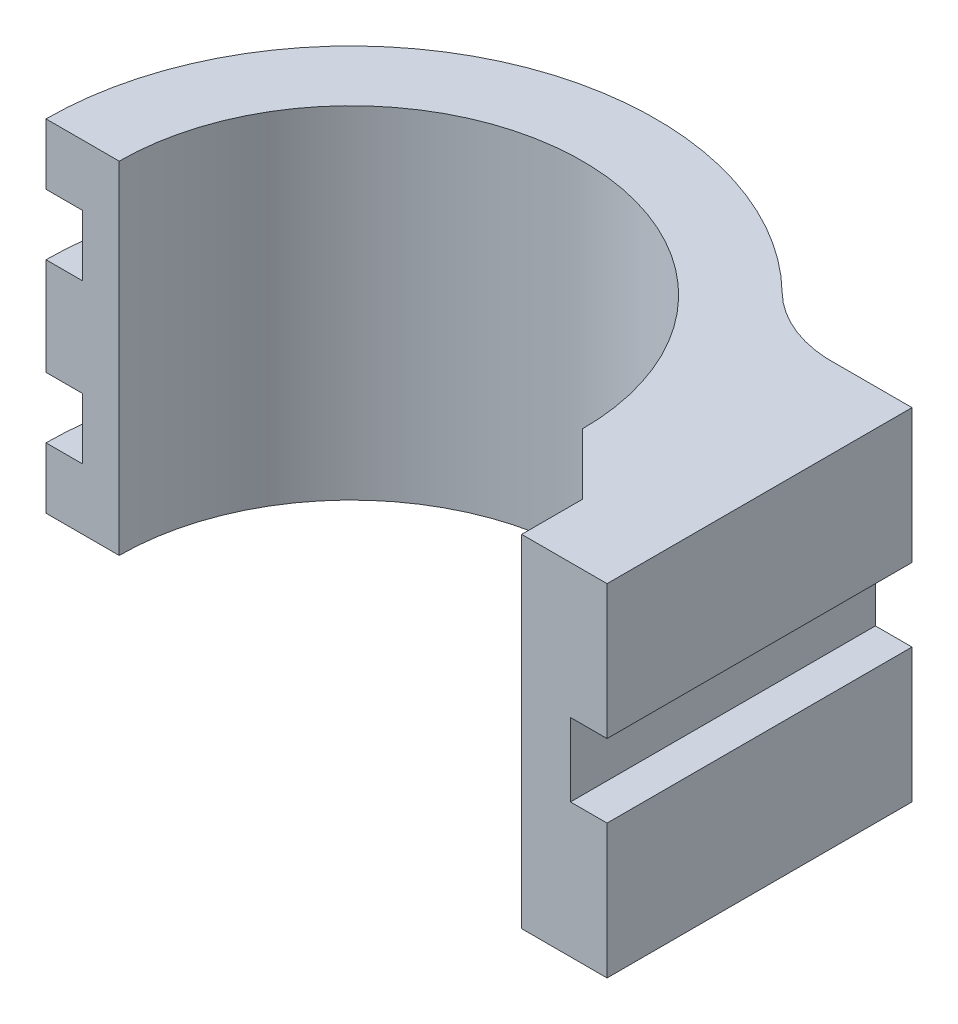
ISO-10303-21;
HEADER;
FILE_DESCRIPTION(('STEP AP214'),'2;1');
FILE_NAME('part.step','',(''),(''),'','','');
FILE_SCHEMA(('AUTOMOTIVE_DESIGN { 1 0 10303 214 1 1 1 1 }'));
ENDSEC;
DATA;
#1=APPLICATION_CONTEXT('core data for automotive mechanical design processes');
#2=APPLICATION_PROTOCOL_DEFINITION('international standard','automotive_design',2000,#1);
#3=PRODUCT_CONTEXT('',#1,'mechanical');
#4=PRODUCT('Part','Part','',(#3));
#5=PRODUCT_RELATED_PRODUCT_CATEGORY('part','',(#4));
#6=PRODUCT_DEFINITION_FORMATION('','',#4);
#7=PRODUCT_DEFINITION_CONTEXT('part definition',#1,'design');
#8=PRODUCT_DEFINITION('design','',#6,#7);
#9=PRODUCT_DEFINITION_SHAPE('','',#8);
#10=(LENGTH_UNIT() NAMED_UNIT(*) SI_UNIT(.MILLI.,.METRE.));
#11=(NAMED_UNIT(*) PLANE_ANGLE_UNIT() SI_UNIT($,.RADIAN.));
#12=(NAMED_UNIT(*) SI_UNIT($,.STERADIAN.) SOLID_ANGLE_UNIT());
#13=UNCERTAINTY_MEASURE_WITH_UNIT(LENGTH_MEASURE(1.E-05),#10,'distance_accuracy_value','');
#14=(GEOMETRIC_REPRESENTATION_CONTEXT(3) GLOBAL_UNCERTAINTY_ASSIGNED_CONTEXT((#13)) GLOBAL_UNIT_ASSIGNED_CONTEXT((#10,
#11,#12)) REPRESENTATION_CONTEXT('',''));
#15=CARTESIAN_POINT('',(0.,0.,0.));
#16=DIRECTION('',(0.,0.,1.));
#17=DIRECTION('',(1.,0.,0.));
#18=AXIS2_PLACEMENT_3D('',#15,#16,#17);
#19=CARTESIAN_POINT('',(31.,0.,-15.));
#20=DIRECTION('',(1.,0.,0.));
#21=DIRECTION('',(0.,0.,-1.));
#22=AXIS2_PLACEMENT_3D('',#19,#20,#21);
#23=PLANE('',#22);
#24=DIRECTION('',(0.,0.,-1.));
#25=VECTOR('',#24,1.);
#26=CARTESIAN_POINT('',(31.,17.,25.));
#27=LINE('',#26,#25);
#28=CARTESIAN_POINT('',(31.,17.,10.));
#29=VERTEX_POINT('',#28);
#30=CARTESIAN_POINT('',(31.,17.,-15.));
#31=VERTEX_POINT('',#30);
#32=EDGE_CURVE('E369',#29,#31,#27,.T.);
#33=ORIENTED_EDGE('',*,*,#32,.T.);
#34=DIRECTION('',(0.,1.,0.));
#35=VECTOR('',#34,1.);
#36=CARTESIAN_POINT('',(31.,0.,-15.));
#37=LINE('',#36,#35);
#38=CARTESIAN_POINT('',(31.,28.,-15.));
#39=VERTEX_POINT('',#38);
#40=EDGE_CURVE('E224',#31,#39,#37,.T.);
#41=ORIENTED_EDGE('',*,*,#40,.T.);
#42=DIRECTION('',(0.,0.,1.));
#43=VECTOR('',#42,1.);
#44=CARTESIAN_POINT('',(31.,28.,-15.));
#45=LINE('',#44,#43);
#46=CARTESIAN_POINT('',(31.,28.,10.));
#47=VERTEX_POINT('',#46);
#48=EDGE_CURVE('E226',#39,#47,#45,.T.);
#49=ORIENTED_EDGE('',*,*,#48,.T.);
#50=DIRECTION('',(0.,1.,0.));
#51=VECTOR('',#50,1.);
#52=CARTESIAN_POINT('',(31.,28.,10.));
#53=LINE('',#52,#51);
#54=EDGE_CURVE('E372',#29,#47,#53,.T.);
#55=ORIENTED_EDGE('',*,*,#54,.F.);
#56=EDGE_LOOP('',(#33,#41,#49,#55));
#57=FACE_BOUND('',#56,.T.);
#58=ADVANCED_FACE('F33',(#57),#23,.T.);
#59=CARTESIAN_POINT('',(0.,0.,0.));
#60=DIRECTION('',(0.,0.,-1.));
#61=DIRECTION('',(-1.,0.,0.));
#62=AXIS2_PLACEMENT_3D('',#59,#60,#61);
#63=PLANE('',#62);
#64=DIRECTION('',(-1.,0.,0.));
#65=VECTOR('',#64,1.);
#66=CARTESIAN_POINT('',(0.,0.,0.));
#67=LINE('',#66,#65);
#68=CARTESIAN_POINT('',(-19.,0.,1.32676290876039E-13));
#69=VERTEX_POINT('',#68);
#70=CARTESIAN_POINT('',(-25.,0.,1.74574066942157E-13));
#71=VERTEX_POINT('',#70);
#72=EDGE_CURVE('E247',#69,#71,#67,.T.);
#73=ORIENTED_EDGE('',*,*,#72,.F.);
#74=DIRECTION('',(0.,1.,0.));
#75=VECTOR('',#74,1.);
#76=CARTESIAN_POINT('',(-19.,-1.00000000000001,1.32676290876039E-13));
#77=LINE('',#76,#75);
#78=CARTESIAN_POINT('',(-19.,28.,1.32676290876039E-13));
#79=VERTEX_POINT('',#78);
#80=EDGE_CURVE('E307',#69,#79,#77,.T.);
#81=ORIENTED_EDGE('',*,*,#80,.T.);
#82=DIRECTION('',(1.,0.,0.));
#83=VECTOR('',#82,1.);
#84=CARTESIAN_POINT('',(0.,28.,0.));
#85=LINE('',#84,#83);
#86=CARTESIAN_POINT('',(-25.,28.,1.74574066942157E-13));
#87=VERTEX_POINT('',#86);
#88=EDGE_CURVE('E276',#87,#79,#85,.T.);
#89=ORIENTED_EDGE('',*,*,#88,.F.);
#90=DIRECTION('',(0.,1.,0.));
#91=VECTOR('',#90,1.);
#92=CARTESIAN_POINT('',(-25.,28.,1.74574066942157E-13));
#93=LINE('',#92,#91);
#94=CARTESIAN_POINT('',(-25.,23.,1.74574066942157E-13));
#95=VERTEX_POINT('',#94);
#96=EDGE_CURVE('E273',#95,#87,#93,.T.);
#97=ORIENTED_EDGE('',*,*,#96,.F.);
#98=DIRECTION('',(-1.,0.,0.));
#99=VECTOR('',#98,1.);
#100=CARTESIAN_POINT('',(-25.,23.,1.74574066942157E-13));
#101=LINE('',#100,#99);
#102=CARTESIAN_POINT('',(-22.,23.,1.53625178909098E-13));
#103=VERTEX_POINT('',#102);
#104=EDGE_CURVE('E270',#103,#95,#101,.T.);
#105=ORIENTED_EDGE('',*,*,#104,.F.);
#106=DIRECTION('',(0.,1.,0.));
#107=VECTOR('',#106,1.);
#108=CARTESIAN_POINT('',(-22.,23.,1.53625178909098E-13));
#109=LINE('',#108,#107);
#110=CARTESIAN_POINT('',(-22.,18.,1.53625178909098E-13));
#111=VERTEX_POINT('',#110);
#112=EDGE_CURVE('E267',#111,#103,#109,.T.);
#113=ORIENTED_EDGE('',*,*,#112,.F.);
#114=DIRECTION('',(1.,0.,0.));
#115=VECTOR('',#114,1.);
#116=CARTESIAN_POINT('',(-22.,18.,1.53625178909098E-13));
#117=LINE('',#116,#115);
#118=CARTESIAN_POINT('',(-25.,18.,1.74574066942157E-13));
#119=VERTEX_POINT('',#118);
#120=EDGE_CURVE('E264',#119,#111,#117,.T.);
#121=ORIENTED_EDGE('',*,*,#120,.F.);
#122=DIRECTION('',(0.,1.,0.));
#123=VECTOR('',#122,1.);
#124=CARTESIAN_POINT('',(-25.,10.,1.74574066942157E-13));
#125=LINE('',#124,#123);
#126=CARTESIAN_POINT('',(-25.,10.,1.74574066942157E-13));
#127=VERTEX_POINT('',#126);
#128=EDGE_CURVE('E261',#127,#119,#125,.T.);
#129=ORIENTED_EDGE('',*,*,#128,.F.);
#130=DIRECTION('',(-1.,0.,0.));
#131=VECTOR('',#130,1.);
#132=CARTESIAN_POINT('',(-22.,10.,1.53625178909098E-13));
#133=LINE('',#132,#131);
#134=CARTESIAN_POINT('',(-22.,10.,1.53625178909098E-13));
#135=VERTEX_POINT('',#134);
#136=EDGE_CURVE('E258',#135,#127,#133,.T.);
#137=ORIENTED_EDGE('',*,*,#136,.F.);
#138=DIRECTION('',(0.,1.,0.));
#139=VECTOR('',#138,1.);
#140=CARTESIAN_POINT('',(-22.,5.,1.53625178909098E-13));
#141=LINE('',#140,#139);
#142=CARTESIAN_POINT('',(-22.,5.,1.53625178909098E-13));
#143=VERTEX_POINT('',#142);
#144=EDGE_CURVE('E255',#143,#135,#141,.T.);
#145=ORIENTED_EDGE('',*,*,#144,.F.);
#146=DIRECTION('',(1.,0.,0.));
#147=VECTOR('',#146,1.);
#148=CARTESIAN_POINT('',(-25.,5.,1.74574066942157E-13));
#149=LINE('',#148,#147);
#150=CARTESIAN_POINT('',(-25.,5.,1.74574066942157E-13));
#151=VERTEX_POINT('',#150);
#152=EDGE_CURVE('E252',#151,#143,#149,.T.);
#153=ORIENTED_EDGE('',*,*,#152,.F.);
#154=DIRECTION('',(0.,1.,0.));
#155=VECTOR('',#154,1.);
#156=CARTESIAN_POINT('',(-25.,0.,1.74574066942157E-13));
#157=LINE('',#156,#155);
#158=EDGE_CURVE('E249',#71,#151,#157,.T.);
#159=ORIENTED_EDGE('',*,*,#158,.F.);
#160=EDGE_LOOP('',(#73,#81,#89,#97,#105,#113,#121,#129,#137,#145,#153,#159));
#161=FACE_BOUND('',#160,.T.);
#162=ADVANCED_FACE('F447',(#161),#63,.F.);
#163=CARTESIAN_POINT('',(0.,0.,0.));
#164=DIRECTION('',(0.,-1.,0.));
#165=DIRECTION('',(0.,0.,-1.));
#166=AXIS2_PLACEMENT_3D('',#163,#164,#165);
#167=PLANE('',#166);
#168=CARTESIAN_POINT('',(0.,0.,0.));
#169=DIRECTION('',(0.,-1.,0.));
#170=DIRECTION('',(0.,0.,-1.));
#171=AXIS2_PLACEMENT_3D('',#168,#169,#170);
#172=CIRCLE('',#171,25.);
#173=CARTESIAN_POINT('',(17.5057657133525,0.,-17.8479177157788));
#174=VERTEX_POINT('',#173);
#175=EDGE_CURVE('E301',#71,#174,#172,.T.);
#176=ORIENTED_EDGE('',*,*,#175,.T.);
#177=CARTESIAN_POINT('',(24.5080719986936,0.,-24.9870848020903));
#178=DIRECTION('',(0.,-1.,0.));
#179=DIRECTION('',(0.,0.,-1.));
#180=AXIS2_PLACEMENT_3D('',#177,#178,#179);
#181=CIRCLE('',#180,10.);
#182=CARTESIAN_POINT('',(24.,0.,-15.));
#183=VERTEX_POINT('',#182);
#184=EDGE_CURVE('E358',#174,#183,#181,.F.);
#185=ORIENTED_EDGE('',*,*,#184,.T.);
#186=DIRECTION('',(1.,0.,0.));
#187=VECTOR('',#186,1.);
#188=CARTESIAN_POINT('',(24.,0.,-15.));
#189=LINE('',#188,#187);
#190=CARTESIAN_POINT('',(31.,0.,-15.));
#191=VERTEX_POINT('',#190);
#192=EDGE_CURVE('E228',#183,#191,#189,.T.);
#193=ORIENTED_EDGE('',*,*,#192,.T.);
#194=DIRECTION('',(0.,0.,1.));
#195=VECTOR('',#194,1.);
#196=CARTESIAN_POINT('',(31.,0.,-15.));
#197=LINE('',#196,#195);
#198=CARTESIAN_POINT('',(31.,0.,10.));
#199=VERTEX_POINT('',#198);
#200=EDGE_CURVE('E222',#191,#199,#197,.T.);
#201=ORIENTED_EDGE('',*,*,#200,.T.);
#202=DIRECTION('',(1.,0.,0.));
#203=VECTOR('',#202,1.);
#204=CARTESIAN_POINT('',(31.,0.,10.));
#205=LINE('',#204,#203);
#206=CARTESIAN_POINT('',(24.,0.,10.));
#207=VERTEX_POINT('',#206);
#208=EDGE_CURVE('E383',#207,#199,#205,.T.);
#209=ORIENTED_EDGE('',*,*,#208,.F.);
#210=DIRECTION('',(0.,0.,-1.));
#211=VECTOR('',#210,1.);
#212=CARTESIAN_POINT('',(24.,0.,10.));
#213=LINE('',#212,#211);
#214=CARTESIAN_POINT('',(24.,0.,5.));
#215=VERTEX_POINT('',#214);
#216=EDGE_CURVE('E386',#207,#215,#213,.T.);
#217=ORIENTED_EDGE('',*,*,#216,.T.);
#218=DIRECTION('',(-0.707106781186549,0.,-0.707106781186546));
#219=VECTOR('',#218,1.);
#220=CARTESIAN_POINT('',(24.,0.,5.));
#221=LINE('',#220,#219);
#222=CARTESIAN_POINT('',(19.,0.,-1.32676290876039E-13));
#223=VERTEX_POINT('',#222);
#224=EDGE_CURVE('E319',#215,#223,#221,.T.);
#225=ORIENTED_EDGE('',*,*,#224,.T.);
#226=CARTESIAN_POINT('',(0.,0.,0.));
#227=DIRECTION('',(0.,-1.,0.));
#228=DIRECTION('',(0.,0.,-1.));
#229=AXIS2_PLACEMENT_3D('',#226,#227,#228);
#230=CIRCLE('',#229,19.);
#231=EDGE_CURVE('E244',#69,#223,#230,.T.);
#232=ORIENTED_EDGE('',*,*,#231,.F.);
#233=ORIENTED_EDGE('',*,*,#72,.T.);
#234=EDGE_LOOP('',(#176,#185,#193,#201,#209,#217,#225,#232,#233));
#235=FACE_BOUND('',#234,.T.);
#236=ADVANCED_FACE('F452',(#235),#167,.T.);
#237=CARTESIAN_POINT('',(0.,0.,0.));
#238=DIRECTION('',(0.,-1.,0.));
#239=DIRECTION('',(0.,0.,-1.));
#240=AXIS2_PLACEMENT_3D('',#237,#238,#239);
#241=CYLINDRICAL_SURFACE('',#240,25.);
#242=CARTESIAN_POINT('',(0.,5.,0.));
#243=DIRECTION('',(0.,-1.,0.));
#244=DIRECTION('',(0.,0.,-1.));
#245=AXIS2_PLACEMENT_3D('',#242,#243,#244);
#246=CIRCLE('',#245,25.);
#247=CARTESIAN_POINT('',(17.5057657133525,5.,-17.8479177157788));
#248=VERTEX_POINT('',#247);
#249=EDGE_CURVE('E299',#151,#248,#246,.T.);
#250=ORIENTED_EDGE('',*,*,#249,.T.);
#251=DIRECTION('',(0.,-1.,0.));
#252=VECTOR('',#251,1.);
#253=CARTESIAN_POINT('',(17.5057657133525,0.,-17.8479177157788));
#254=LINE('',#253,#252);
#255=EDGE_CURVE('E345',#248,#174,#254,.T.);
#256=ORIENTED_EDGE('',*,*,#255,.T.);
#257=ORIENTED_EDGE('',*,*,#175,.F.);
#258=ORIENTED_EDGE('',*,*,#158,.T.);
#259=EDGE_LOOP('',(#250,#256,#257,#258));
#260=FACE_BOUND('',#259,.T.);
#261=ADVANCED_FACE('F471',(#260),#241,.T.);
#262=CARTESIAN_POINT('',(-25.,5.,1.74574066942157E-13));
#263=DIRECTION('',(0.,1.,0.));
#264=DIRECTION('',(0.,0.,1.));
#265=AXIS2_PLACEMENT_3D('',#262,#263,#264);
#266=PLANE('',#265);
#267=DIRECTION('',(0.,0.,1.));
#268=VECTOR('',#267,1.);
#269=CARTESIAN_POINT('',(24.,5.,1.74574066942157E-13));
#270=LINE('',#269,#268);
#271=CARTESIAN_POINT('',(24.,5.,-15.));
#272=VERTEX_POINT('',#271);
#273=CARTESIAN_POINT('',(24.,5.,5.));
#274=VERTEX_POINT('',#273);
#275=EDGE_CURVE('E240',#272,#274,#270,.T.);
#276=ORIENTED_EDGE('',*,*,#275,.F.);
#277=CARTESIAN_POINT('',(24.5080719986936,5.,-24.9870848020903));
#278=DIRECTION('',(0.,1.,0.));
#279=DIRECTION('',(0.,0.,1.));
#280=AXIS2_PLACEMENT_3D('',#277,#278,#279);
#281=CIRCLE('',#280,10.);
#282=EDGE_CURVE('E56',#272,#248,#281,.F.);
#283=ORIENTED_EDGE('',*,*,#282,.T.);
#284=ORIENTED_EDGE('',*,*,#249,.F.);
#285=ORIENTED_EDGE('',*,*,#152,.T.);
#286=CARTESIAN_POINT('',(0.,5.,0.));
#287=DIRECTION('',(0.,-1.,0.));
#288=DIRECTION('',(0.,0.,-1.));
#289=AXIS2_PLACEMENT_3D('',#286,#287,#288);
#290=CIRCLE('',#289,22.);
#291=CARTESIAN_POINT('',(21.8186849947549,5.,2.81868499475493));
#292=VERTEX_POINT('',#291);
#293=EDGE_CURVE('E297',#143,#292,#290,.T.);
#294=ORIENTED_EDGE('',*,*,#293,.T.);
#295=DIRECTION('',(0.707106781186549,0.,0.707106781186546));
#296=VECTOR('',#295,1.);
#297=CARTESIAN_POINT('',(24.,5.,5.));
#298=LINE('',#297,#296);
#299=EDGE_CURVE('E338',#292,#274,#298,.T.);
#300=ORIENTED_EDGE('',*,*,#299,.T.);
#301=EDGE_LOOP('',(#276,#283,#284,#285,#294,#300));
#302=FACE_BOUND('',#301,.T.);
#303=ADVANCED_FACE('F497',(#302),#266,.T.);
#304=CARTESIAN_POINT('',(0.,0.,0.));
#305=DIRECTION('',(0.,-1.,0.));
#306=DIRECTION('',(0.,0.,-1.));
#307=AXIS2_PLACEMENT_3D('',#304,#305,#306);
#308=CYLINDRICAL_SURFACE('',#307,22.);
#309=CARTESIAN_POINT('',(0.,10.,0.));
#310=DIRECTION('',(0.,-1.,0.));
#311=DIRECTION('',(0.,0.,-1.));
#312=AXIS2_PLACEMENT_3D('',#309,#310,#311);
#313=CIRCLE('',#312,22.);
#314=CARTESIAN_POINT('',(21.8186849947549,10.,2.81868499475493));
#315=VERTEX_POINT('',#314);
#316=EDGE_CURVE('E295',#135,#315,#313,.T.);
#317=ORIENTED_EDGE('',*,*,#316,.T.);
#318=DIRECTION('',(0.,-1.,0.));
#319=VECTOR('',#318,1.);
#320=CARTESIAN_POINT('',(21.8186849947549,10.,2.81868499475493));
#321=LINE('',#320,#319);
#322=EDGE_CURVE('E335',#315,#292,#321,.T.);
#323=ORIENTED_EDGE('',*,*,#322,.T.);
#324=ORIENTED_EDGE('',*,*,#293,.F.);
#325=ORIENTED_EDGE('',*,*,#144,.T.);
#326=EDGE_LOOP('',(#317,#323,#324,#325));
#327=FACE_BOUND('',#326,.T.);
#328=ADVANCED_FACE('F493',(#327),#308,.T.);
#329=CARTESIAN_POINT('',(-22.,10.,1.53625178909098E-13));
#330=DIRECTION('',(0.,-1.,0.));
#331=DIRECTION('',(0.,0.,-1.));
#332=AXIS2_PLACEMENT_3D('',#329,#330,#331);
#333=PLANE('',#332);
#334=DIRECTION('',(0.,0.,-1.));
#335=VECTOR('',#334,1.);
#336=CARTESIAN_POINT('',(24.,10.,1.53625178909098E-13));
#337=LINE('',#336,#335);
#338=CARTESIAN_POINT('',(24.,10.,5.));
#339=VERTEX_POINT('',#338);
#340=CARTESIAN_POINT('',(24.,10.,-15.));
#341=VERTEX_POINT('',#340);
#342=EDGE_CURVE('E238',#339,#341,#337,.T.);
#343=ORIENTED_EDGE('',*,*,#342,.F.);
#344=DIRECTION('',(-0.707106781186549,0.,-0.707106781186546));
#345=VECTOR('',#344,1.);
#346=CARTESIAN_POINT('',(24.,10.,5.));
#347=LINE('',#346,#345);
#348=EDGE_CURVE('E332',#339,#315,#347,.T.);
#349=ORIENTED_EDGE('',*,*,#348,.T.);
#350=ORIENTED_EDGE('',*,*,#316,.F.);
#351=ORIENTED_EDGE('',*,*,#136,.T.);
#352=CARTESIAN_POINT('',(0.,10.,0.));
#353=DIRECTION('',(0.,-1.,0.));
#354=DIRECTION('',(0.,0.,-1.));
#355=AXIS2_PLACEMENT_3D('',#352,#353,#354);
#356=CIRCLE('',#355,25.);
#357=CARTESIAN_POINT('',(17.5057657133525,10.,-17.8479177157788));
#358=VERTEX_POINT('',#357);
#359=EDGE_CURVE('E292',#127,#358,#356,.T.);
#360=ORIENTED_EDGE('',*,*,#359,.T.);
#361=CARTESIAN_POINT('',(24.5080719986936,10.,-24.9870848020903));
#362=DIRECTION('',(0.,-1.,0.));
#363=DIRECTION('',(0.,0.,-1.));
#364=AXIS2_PLACEMENT_3D('',#361,#362,#363);
#365=CIRCLE('',#364,10.);
#366=EDGE_CURVE('E354',#358,#341,#365,.F.);
#367=ORIENTED_EDGE('',*,*,#366,.T.);
#368=EDGE_LOOP('',(#343,#349,#350,#351,#360,#367));
#369=FACE_BOUND('',#368,.T.);
#370=ADVANCED_FACE('F489',(#369),#333,.T.);
#371=CARTESIAN_POINT('',(0.,0.,0.));
#372=DIRECTION('',(0.,-1.,0.));
#373=DIRECTION('',(0.,0.,-1.));
#374=AXIS2_PLACEMENT_3D('',#371,#372,#373);
#375=CYLINDRICAL_SURFACE('',#374,25.);
#376=CARTESIAN_POINT('',(0.,18.,0.));
#377=DIRECTION('',(0.,-1.,0.));
#378=DIRECTION('',(0.,0.,-1.));
#379=AXIS2_PLACEMENT_3D('',#376,#377,#378);
#380=CIRCLE('',#379,25.);
#381=CARTESIAN_POINT('',(17.5057657133525,18.,-17.8479177157788));
#382=VERTEX_POINT('',#381);
#383=EDGE_CURVE('E289',#119,#382,#380,.T.);
#384=ORIENTED_EDGE('',*,*,#383,.T.);
#385=DIRECTION('',(0.,-1.,0.));
#386=VECTOR('',#385,1.);
#387=CARTESIAN_POINT('',(17.5057657133525,0.,-17.8479177157788));
#388=LINE('',#387,#386);
#389=EDGE_CURVE('E343',#382,#358,#388,.T.);
#390=ORIENTED_EDGE('',*,*,#389,.T.);
#391=ORIENTED_EDGE('',*,*,#359,.F.);
#392=ORIENTED_EDGE('',*,*,#128,.T.);
#393=EDGE_LOOP('',(#384,#390,#391,#392));
#394=FACE_BOUND('',#393,.T.);
#395=ADVANCED_FACE('F485',(#394),#375,.T.);
#396=CARTESIAN_POINT('',(-22.,18.,1.53625178909098E-13));
#397=DIRECTION('',(0.,1.,0.));
#398=DIRECTION('',(0.,0.,1.));
#399=AXIS2_PLACEMENT_3D('',#396,#397,#398);
#400=PLANE('',#399);
#401=DIRECTION('',(0.,0.,1.));
#402=VECTOR('',#401,1.);
#403=CARTESIAN_POINT('',(24.,18.,1.53625178909098E-13));
#404=LINE('',#403,#402);
#405=CARTESIAN_POINT('',(24.,18.,-15.));
#406=VERTEX_POINT('',#405);
#407=CARTESIAN_POINT('',(24.,18.,5.));
#408=VERTEX_POINT('',#407);
#409=EDGE_CURVE('E236',#406,#408,#404,.T.);
#410=ORIENTED_EDGE('',*,*,#409,.F.);
#411=CARTESIAN_POINT('',(24.5080719986936,18.,-24.9870848020903));
#412=DIRECTION('',(0.,1.,0.));
#413=DIRECTION('',(0.,0.,1.));
#414=AXIS2_PLACEMENT_3D('',#411,#412,#413);
#415=CIRCLE('',#414,10.);
#416=EDGE_CURVE('E352',#406,#382,#415,.F.);
#417=ORIENTED_EDGE('',*,*,#416,.T.);
#418=ORIENTED_EDGE('',*,*,#383,.F.);
#419=ORIENTED_EDGE('',*,*,#120,.T.);
#420=CARTESIAN_POINT('',(0.,18.,0.));
#421=DIRECTION('',(0.,-1.,0.));
#422=DIRECTION('',(0.,0.,-1.));
#423=AXIS2_PLACEMENT_3D('',#420,#421,#422);
#424=CIRCLE('',#423,22.);
#425=CARTESIAN_POINT('',(21.8186849947549,18.,2.81868499475493));
#426=VERTEX_POINT('',#425);
#427=EDGE_CURVE('E287',#111,#426,#424,.T.);
#428=ORIENTED_EDGE('',*,*,#427,.T.);
#429=DIRECTION('',(0.707106781186549,0.,0.707106781186546));
#430=VECTOR('',#429,1.);
#431=CARTESIAN_POINT('',(24.,18.,5.));
#432=LINE('',#431,#430);
#433=EDGE_CURVE('E329',#426,#408,#432,.T.);
#434=ORIENTED_EDGE('',*,*,#433,.T.);
#435=EDGE_LOOP('',(#410,#417,#418,#419,#428,#434));
#436=FACE_BOUND('',#435,.T.);
#437=ADVANCED_FACE('F481',(#436),#400,.T.);
#438=CARTESIAN_POINT('',(0.,0.,0.));
#439=DIRECTION('',(0.,-1.,0.));
#440=DIRECTION('',(0.,0.,-1.));
#441=AXIS2_PLACEMENT_3D('',#438,#439,#440);
#442=CYLINDRICAL_SURFACE('',#441,22.);
#443=CARTESIAN_POINT('',(0.,23.,0.));
#444=DIRECTION('',(0.,-1.,0.));
#445=DIRECTION('',(0.,0.,-1.));
#446=AXIS2_PLACEMENT_3D('',#443,#444,#445);
#447=CIRCLE('',#446,22.);
#448=CARTESIAN_POINT('',(21.8186849947549,23.,2.81868499475493));
#449=VERTEX_POINT('',#448);
#450=EDGE_CURVE('E285',#103,#449,#447,.T.);
#451=ORIENTED_EDGE('',*,*,#450,.T.);
#452=DIRECTION('',(0.,-1.,0.));
#453=VECTOR('',#452,1.);
#454=CARTESIAN_POINT('',(21.8186849947549,23.,2.81868499475493));
#455=LINE('',#454,#453);
#456=EDGE_CURVE('E326',#449,#426,#455,.T.);
#457=ORIENTED_EDGE('',*,*,#456,.T.);
#458=ORIENTED_EDGE('',*,*,#427,.F.);
#459=ORIENTED_EDGE('',*,*,#112,.T.);
#460=EDGE_LOOP('',(#451,#457,#458,#459));
#461=FACE_BOUND('',#460,.T.);
#462=ADVANCED_FACE('F478',(#461),#442,.T.);
#463=CARTESIAN_POINT('',(-25.,23.,1.74574066942157E-13));
#464=DIRECTION('',(0.,-1.,0.));
#465=DIRECTION('',(0.,0.,-1.));
#466=AXIS2_PLACEMENT_3D('',#463,#464,#465);
#467=PLANE('',#466);
#468=DIRECTION('',(0.,0.,-1.));
#469=VECTOR('',#468,1.);
#470=CARTESIAN_POINT('',(24.,23.,1.74574066942157E-13));
#471=LINE('',#470,#469);
#472=CARTESIAN_POINT('',(24.,23.,5.));
#473=VERTEX_POINT('',#472);
#474=CARTESIAN_POINT('',(24.,23.,-15.));
#475=VERTEX_POINT('',#474);
#476=EDGE_CURVE('E233',#473,#475,#471,.T.);
#477=ORIENTED_EDGE('',*,*,#476,.F.);
#478=DIRECTION('',(-0.707106781186549,0.,-0.707106781186546));
#479=VECTOR('',#478,1.);
#480=CARTESIAN_POINT('',(24.,23.,5.));
#481=LINE('',#480,#479);
#482=EDGE_CURVE('E323',#473,#449,#481,.T.);
#483=ORIENTED_EDGE('',*,*,#482,.T.);
#484=ORIENTED_EDGE('',*,*,#450,.F.);
#485=ORIENTED_EDGE('',*,*,#104,.T.);
#486=CARTESIAN_POINT('',(0.,23.,0.));
#487=DIRECTION('',(0.,-1.,0.));
#488=DIRECTION('',(0.,0.,-1.));
#489=AXIS2_PLACEMENT_3D('',#486,#487,#488);
#490=CIRCLE('',#489,25.);
#491=CARTESIAN_POINT('',(17.5057657133525,23.,-17.8479177157788));
#492=VERTEX_POINT('',#491);
#493=EDGE_CURVE('E282',#95,#492,#490,.T.);
#494=ORIENTED_EDGE('',*,*,#493,.T.);
#495=CARTESIAN_POINT('',(24.5080719986936,23.,-24.9870848020903));
#496=DIRECTION('',(0.,-1.,0.));
#497=DIRECTION('',(0.,0.,-1.));
#498=AXIS2_PLACEMENT_3D('',#495,#496,#497);
#499=CIRCLE('',#498,10.);
#500=EDGE_CURVE('E349',#492,#475,#499,.F.);
#501=ORIENTED_EDGE('',*,*,#500,.T.);
#502=EDGE_LOOP('',(#477,#483,#484,#485,#494,#501));
#503=FACE_BOUND('',#502,.T.);
#504=ADVANCED_FACE('F423',(#503),#467,.T.);
#505=CARTESIAN_POINT('',(0.,0.,0.));
#506=DIRECTION('',(0.,-1.,0.));
#507=DIRECTION('',(0.,0.,-1.));
#508=AXIS2_PLACEMENT_3D('',#505,#506,#507);
#509=CYLINDRICAL_SURFACE('',#508,25.);
#510=CARTESIAN_POINT('',(0.,28.,0.));
#511=DIRECTION('',(0.,-1.,0.));
#512=DIRECTION('',(0.,0.,-1.));
#513=AXIS2_PLACEMENT_3D('',#510,#511,#512);
#514=CIRCLE('',#513,25.);
#515=CARTESIAN_POINT('',(17.5057657133525,28.,-17.8479177157788));
#516=VERTEX_POINT('',#515);
#517=EDGE_CURVE('E279',#87,#516,#514,.T.);
#518=ORIENTED_EDGE('',*,*,#517,.T.);
#519=DIRECTION('',(0.,-1.,0.));
#520=VECTOR('',#519,1.);
#521=CARTESIAN_POINT('',(17.5057657133525,0.,-17.8479177157788));
#522=LINE('',#521,#520);
#523=EDGE_CURVE('E341',#516,#492,#522,.T.);
#524=ORIENTED_EDGE('',*,*,#523,.T.);
#525=ORIENTED_EDGE('',*,*,#493,.F.);
#526=ORIENTED_EDGE('',*,*,#96,.T.);
#527=EDGE_LOOP('',(#518,#524,#525,#526));
#528=FACE_BOUND('',#527,.T.);
#529=ADVANCED_FACE('F427',(#528),#509,.T.);
#530=CARTESIAN_POINT('',(0.,28.,0.));
#531=DIRECTION('',(0.,1.,0.));
#532=DIRECTION('',(0.,0.,1.));
#533=AXIS2_PLACEMENT_3D('',#530,#531,#532);
#534=PLANE('',#533);
#535=CARTESIAN_POINT('',(0.,28.,0.));
#536=DIRECTION('',(0.,1.,0.));
#537=DIRECTION('',(0.,0.,1.));
#538=AXIS2_PLACEMENT_3D('',#535,#536,#537);
#539=CIRCLE('',#538,19.);
#540=CARTESIAN_POINT('',(19.,28.,-1.32676290876039E-13));
#541=VERTEX_POINT('',#540);
#542=EDGE_CURVE('E242',#541,#79,#539,.T.);
#543=ORIENTED_EDGE('',*,*,#542,.F.);
#544=DIRECTION('',(0.707106781186549,0.,0.707106781186546));
#545=VECTOR('',#544,1.);
#546=CARTESIAN_POINT('',(24.,28.,5.));
#547=LINE('',#546,#545);
#548=CARTESIAN_POINT('',(24.,28.,5.));
#549=VERTEX_POINT('',#548);
#550=EDGE_CURVE('E321',#541,#549,#547,.T.);
#551=ORIENTED_EDGE('',*,*,#550,.T.);
#552=DIRECTION('',(0.,0.,-1.));
#553=VECTOR('',#552,1.);
#554=CARTESIAN_POINT('',(24.,28.,10.));
#555=LINE('',#554,#553);
#556=CARTESIAN_POINT('',(24.,28.,10.));
#557=VERTEX_POINT('',#556);
#558=EDGE_CURVE('E389',#557,#549,#555,.T.);
#559=ORIENTED_EDGE('',*,*,#558,.F.);
#560=DIRECTION('',(-1.,0.,0.));
#561=VECTOR('',#560,1.);
#562=CARTESIAN_POINT('',(24.,28.,10.));
#563=LINE('',#562,#561);
#564=EDGE_CURVE('E379',#47,#557,#563,.T.);
#565=ORIENTED_EDGE('',*,*,#564,.F.);
#566=ORIENTED_EDGE('',*,*,#48,.F.);
#567=DIRECTION('',(-1.,0.,0.));
#568=VECTOR('',#567,1.);
#569=CARTESIAN_POINT('',(31.,28.,-15.));
#570=LINE('',#569,#568);
#571=CARTESIAN_POINT('',(24.,28.,-15.));
#572=VERTEX_POINT('',#571);
#573=EDGE_CURVE('E392',#39,#572,#570,.T.);
#574=ORIENTED_EDGE('',*,*,#573,.T.);
#575=CARTESIAN_POINT('',(24.5080719986936,28.,-24.9870848020903));
#576=DIRECTION('',(0.,1.,0.));
#577=DIRECTION('',(0.,0.,1.));
#578=AXIS2_PLACEMENT_3D('',#575,#576,#577);
#579=CIRCLE('',#578,10.);
#580=EDGE_CURVE('E347',#572,#516,#579,.F.);
#581=ORIENTED_EDGE('',*,*,#580,.T.);
#582=ORIENTED_EDGE('',*,*,#517,.F.);
#583=ORIENTED_EDGE('',*,*,#88,.T.);
#584=EDGE_LOOP('',(#543,#551,#559,#565,#566,#574,#581,#582,#583));
#585=FACE_BOUND('',#584,.T.);
#586=ADVANCED_FACE('F432',(#585),#534,.T.);
#587=CARTESIAN_POINT('',(0.,-1.00000000000001,0.));
#588=DIRECTION('',(0.,1.,0.));
#589=DIRECTION('',(0.,0.,1.));
#590=AXIS2_PLACEMENT_3D('',#587,#588,#589);
#591=CYLINDRICAL_SURFACE('',#590,19.);
#592=ORIENTED_EDGE('',*,*,#231,.T.);
#593=DIRECTION('',(0.,1.,0.));
#594=VECTOR('',#593,1.);
#595=CARTESIAN_POINT('',(19.,-1.00000000000001,-1.32676290876039E-13));
#596=LINE('',#595,#594);
#597=EDGE_CURVE('E304',#541,#223,#596,.F.);
#598=ORIENTED_EDGE('',*,*,#597,.F.);
#599=ORIENTED_EDGE('',*,*,#542,.T.);
#600=ORIENTED_EDGE('',*,*,#80,.F.);
#601=EDGE_LOOP('',(#592,#598,#599,#600));
#602=FACE_BOUND('',#601,.T.);
#603=ADVANCED_FACE('F458',(#602),#591,.F.);
#604=DIRECTION('',(0.,0.,-1.));
#605=VECTOR('',#604,1.);
#606=CARTESIAN_POINT('',(31.,11.,25.));
#607=LINE('',#606,#605);
#608=CARTESIAN_POINT('',(31.,11.,10.));
#609=VERTEX_POINT('',#608);
#610=CARTESIAN_POINT('',(31.,11.,-15.));
#611=VERTEX_POINT('',#610);
#612=EDGE_CURVE('E198',#609,#611,#607,.T.);
#613=ORIENTED_EDGE('',*,*,#612,.F.);
#614=EDGE_CURVE('E377',#199,#609,#53,.T.);
#615=ORIENTED_EDGE('',*,*,#614,.F.);
#616=ORIENTED_EDGE('',*,*,#200,.F.);
#617=EDGE_CURVE('E216',#191,#611,#37,.T.);
#618=ORIENTED_EDGE('',*,*,#617,.T.);
#619=EDGE_LOOP('',(#613,#615,#616,#618));
#620=FACE_BOUND('',#619,.T.);
#621=ADVANCED_FACE('F221',(#620),#23,.T.);
#622=CARTESIAN_POINT('',(24.,28.,-15.));
#623=DIRECTION('',(-1.,0.,0.));
#624=DIRECTION('',(0.,0.,1.));
#625=AXIS2_PLACEMENT_3D('',#622,#623,#624);
#626=PLANE('',#625);
#627=ORIENTED_EDGE('',*,*,#476,.T.);
#628=DIRECTION('',(0.,-1.,0.));
#629=VECTOR('',#628,1.);
#630=CARTESIAN_POINT('',(24.,28.,-15.));
#631=LINE('',#630,#629);
#632=EDGE_CURVE('E397',#475,#406,#631,.T.);
#633=ORIENTED_EDGE('',*,*,#632,.T.);
#634=ORIENTED_EDGE('',*,*,#409,.T.);
#635=DIRECTION('',(0.,-1.,0.));
#636=VECTOR('',#635,1.);
#637=CARTESIAN_POINT('',(24.,28.,5.));
#638=LINE('',#637,#636);
#639=EDGE_CURVE('E310',#408,#339,#638,.T.);
#640=ORIENTED_EDGE('',*,*,#639,.T.);
#641=ORIENTED_EDGE('',*,*,#342,.T.);
#642=EDGE_CURVE('E404',#341,#272,#631,.T.);
#643=ORIENTED_EDGE('',*,*,#642,.T.);
#644=ORIENTED_EDGE('',*,*,#275,.T.);
#645=DIRECTION('',(0.,-1.,0.));
#646=VECTOR('',#645,1.);
#647=CARTESIAN_POINT('',(24.,28.,5.));
#648=LINE('',#647,#646);
#649=EDGE_CURVE('E316',#274,#215,#648,.T.);
#650=ORIENTED_EDGE('',*,*,#649,.T.);
#651=ORIENTED_EDGE('',*,*,#216,.F.);
#652=DIRECTION('',(0.,-1.,0.));
#653=VECTOR('',#652,1.);
#654=CARTESIAN_POINT('',(24.,0.,10.));
#655=LINE('',#654,#653);
#656=EDGE_CURVE('E381',#557,#207,#655,.T.);
#657=ORIENTED_EDGE('',*,*,#656,.F.);
#658=ORIENTED_EDGE('',*,*,#558,.T.);
#659=DIRECTION('',(0.,-1.,0.));
#660=VECTOR('',#659,1.);
#661=CARTESIAN_POINT('',(24.,28.,5.));
#662=LINE('',#661,#660);
#663=EDGE_CURVE('E313',#549,#473,#662,.T.);
#664=ORIENTED_EDGE('',*,*,#663,.T.);
#665=EDGE_LOOP('',(#627,#633,#634,#640,#641,#643,#644,#650,#651,#657,#658,#664));
#666=FACE_BOUND('',#665,.T.);
#667=ADVANCED_FACE('F419',(#666),#626,.T.);
#668=CARTESIAN_POINT('',(0.,0.,-15.));
#669=DIRECTION('',(0.,0.,1.));
#670=DIRECTION('',(1.,0.,0.));
#671=AXIS2_PLACEMENT_3D('',#668,#669,#670);
#672=PLANE('',#671);
#673=ORIENTED_EDGE('',*,*,#40,.F.);
#674=DIRECTION('',(1.,0.,0.));
#675=VECTOR('',#674,1.);
#676=CARTESIAN_POINT('',(28.,17.,-15.));
#677=LINE('',#676,#675);
#678=CARTESIAN_POINT('',(28.,17.,-15.));
#679=VERTEX_POINT('',#678);
#680=EDGE_CURVE('E209',#679,#31,#677,.T.);
#681=ORIENTED_EDGE('',*,*,#680,.F.);
#682=DIRECTION('',(0.,1.,0.));
#683=VECTOR('',#682,1.);
#684=CARTESIAN_POINT('',(28.,11.,-15.));
#685=LINE('',#684,#683);
#686=CARTESIAN_POINT('',(28.,11.,-15.));
#687=VERTEX_POINT('',#686);
#688=EDGE_CURVE('E219',#687,#679,#685,.T.);
#689=ORIENTED_EDGE('',*,*,#688,.F.);
#690=DIRECTION('',(-1.,0.,0.));
#691=VECTOR('',#690,1.);
#692=CARTESIAN_POINT('',(31.,11.,-15.));
#693=LINE('',#692,#691);
#694=EDGE_CURVE('E201',#611,#687,#693,.T.);
#695=ORIENTED_EDGE('',*,*,#694,.F.);
#696=ORIENTED_EDGE('',*,*,#617,.F.);
#697=ORIENTED_EDGE('',*,*,#192,.F.);
#698=EDGE_CURVE('E394',#272,#183,#631,.T.);
#699=ORIENTED_EDGE('',*,*,#698,.F.);
#700=ORIENTED_EDGE('',*,*,#642,.F.);
#701=EDGE_CURVE('E402',#406,#341,#631,.T.);
#702=ORIENTED_EDGE('',*,*,#701,.F.);
#703=ORIENTED_EDGE('',*,*,#632,.F.);
#704=EDGE_CURVE('E395',#572,#475,#631,.T.);
#705=ORIENTED_EDGE('',*,*,#704,.F.);
#706=ORIENTED_EDGE('',*,*,#573,.F.);
#707=EDGE_LOOP('',(#673,#681,#689,#695,#696,#697,#699,#700,#702,#703,#705,#706));
#708=FACE_BOUND('',#707,.T.);
#709=ADVANCED_FACE('F214',(#708),#672,.F.);
#710=CARTESIAN_POINT('',(0.,0.,10.));
#711=DIRECTION('',(0.,0.,-1.));
#712=DIRECTION('',(-1.,0.,0.));
#713=AXIS2_PLACEMENT_3D('',#710,#711,#712);
#714=PLANE('',#713);
#715=DIRECTION('',(0.,1.,0.));
#716=VECTOR('',#715,1.);
#717=CARTESIAN_POINT('',(28.,0.,10.));
#718=LINE('',#717,#716);
#719=CARTESIAN_POINT('',(28.,11.,10.));
#720=VERTEX_POINT('',#719);
#721=CARTESIAN_POINT('',(28.,17.,10.));
#722=VERTEX_POINT('',#721);
#723=EDGE_CURVE('E41',#720,#722,#718,.T.);
#724=ORIENTED_EDGE('',*,*,#723,.T.);
#725=DIRECTION('',(1.,0.,0.));
#726=VECTOR('',#725,1.);
#727=CARTESIAN_POINT('',(0.,17.,10.));
#728=LINE('',#727,#726);
#729=EDGE_CURVE('E11',#722,#29,#728,.T.);
#730=ORIENTED_EDGE('',*,*,#729,.T.);
#731=ORIENTED_EDGE('',*,*,#54,.T.);
#732=ORIENTED_EDGE('',*,*,#564,.T.);
#733=ORIENTED_EDGE('',*,*,#656,.T.);
#734=ORIENTED_EDGE('',*,*,#208,.T.);
#735=ORIENTED_EDGE('',*,*,#614,.T.);
#736=DIRECTION('',(-1.,0.,0.));
#737=VECTOR('',#736,1.);
#738=CARTESIAN_POINT('',(0.,11.,10.));
#739=LINE('',#738,#737);
#740=EDGE_CURVE('E204',#609,#720,#739,.T.);
#741=ORIENTED_EDGE('',*,*,#740,.T.);
#742=EDGE_LOOP('',(#724,#730,#731,#732,#733,#734,#735,#741));
#743=FACE_BOUND('',#742,.T.);
#744=ADVANCED_FACE('F362',(#743),#714,.F.);
#745=CARTESIAN_POINT('',(24.,28.,5.));
#746=DIRECTION('',(0.707106781186546,0.,-0.707106781186549));
#747=DIRECTION('',(0.,-1.,0.));
#748=AXIS2_PLACEMENT_3D('',#745,#746,#747);
#749=PLANE('',#748);
#750=ORIENTED_EDGE('',*,*,#550,.F.);
#751=ORIENTED_EDGE('',*,*,#597,.T.);
#752=ORIENTED_EDGE('',*,*,#224,.F.);
#753=ORIENTED_EDGE('',*,*,#649,.F.);
#754=ORIENTED_EDGE('',*,*,#299,.F.);
#755=ORIENTED_EDGE('',*,*,#322,.F.);
#756=ORIENTED_EDGE('',*,*,#348,.F.);
#757=ORIENTED_EDGE('',*,*,#639,.F.);
#758=ORIENTED_EDGE('',*,*,#433,.F.);
#759=ORIENTED_EDGE('',*,*,#456,.F.);
#760=ORIENTED_EDGE('',*,*,#482,.F.);
#761=ORIENTED_EDGE('',*,*,#663,.F.);
#762=EDGE_LOOP('',(#750,#751,#752,#753,#754,#755,#756,#757,#758,#759,#760,#761));
#763=FACE_BOUND('',#762,.T.);
#764=ADVANCED_FACE('F504',(#763),#749,.F.);
#765=CARTESIAN_POINT('',(24.5080719986936,0.,-24.9870848020903));
#766=DIRECTION('',(0.,-1.,0.));
#767=DIRECTION('',(0.,0.,-1.));
#768=AXIS2_PLACEMENT_3D('',#765,#766,#767);
#769=CYLINDRICAL_SURFACE('',#768,10.);
#770=ORIENTED_EDGE('',*,*,#500,.F.);
#771=ORIENTED_EDGE('',*,*,#523,.F.);
#772=ORIENTED_EDGE('',*,*,#580,.F.);
#773=ORIENTED_EDGE('',*,*,#704,.T.);
#774=EDGE_LOOP('',(#770,#771,#772,#773));
#775=FACE_BOUND('',#774,.T.);
#776=ADVANCED_FACE('F425',(#775),#769,.F.);
#777=CARTESIAN_POINT('',(24.5080719986936,0.,-24.9870848020903));
#778=DIRECTION('',(0.,-1.,0.));
#779=DIRECTION('',(0.,0.,-1.));
#780=AXIS2_PLACEMENT_3D('',#777,#778,#779);
#781=CYLINDRICAL_SURFACE('',#780,10.);
#782=ORIENTED_EDGE('',*,*,#366,.F.);
#783=ORIENTED_EDGE('',*,*,#389,.F.);
#784=ORIENTED_EDGE('',*,*,#416,.F.);
#785=ORIENTED_EDGE('',*,*,#701,.T.);
#786=EDGE_LOOP('',(#782,#783,#784,#785));
#787=FACE_BOUND('',#786,.T.);
#788=ADVANCED_FACE('F416',(#787),#781,.F.);
#789=CARTESIAN_POINT('',(24.5080719986936,0.,-24.9870848020903));
#790=DIRECTION('',(0.,-1.,0.));
#791=DIRECTION('',(0.,0.,-1.));
#792=AXIS2_PLACEMENT_3D('',#789,#790,#791);
#793=CYLINDRICAL_SURFACE('',#792,10.);
#794=ORIENTED_EDGE('',*,*,#184,.F.);
#795=ORIENTED_EDGE('',*,*,#255,.F.);
#796=ORIENTED_EDGE('',*,*,#282,.F.);
#797=ORIENTED_EDGE('',*,*,#698,.T.);
#798=EDGE_LOOP('',(#794,#795,#796,#797));
#799=FACE_BOUND('',#798,.T.);
#800=ADVANCED_FACE('F35',(#799),#793,.F.);
#801=CARTESIAN_POINT('',(28.,17.,25.));
#802=DIRECTION('',(0.,1.,0.));
#803=DIRECTION('',(0.,0.,1.));
#804=AXIS2_PLACEMENT_3D('',#801,#802,#803);
#805=PLANE('',#804);
#806=DIRECTION('',(0.,0.,-1.));
#807=VECTOR('',#806,1.);
#808=CARTESIAN_POINT('',(28.,17.,25.));
#809=LINE('',#808,#807);
#810=EDGE_CURVE('E367',#722,#679,#809,.T.);
#811=ORIENTED_EDGE('',*,*,#810,.T.);
#812=ORIENTED_EDGE('',*,*,#680,.T.);
#813=ORIENTED_EDGE('',*,*,#32,.F.);
#814=ORIENTED_EDGE('',*,*,#729,.F.);
#815=EDGE_LOOP('',(#811,#812,#813,#814));
#816=FACE_BOUND('',#815,.T.);
#817=ADVANCED_FACE('F437',(#816),#805,.F.);
#818=CARTESIAN_POINT('',(28.,11.,25.));
#819=DIRECTION('',(-1.,0.,0.));
#820=DIRECTION('',(0.,0.,1.));
#821=AXIS2_PLACEMENT_3D('',#818,#819,#820);
#822=PLANE('',#821);
#823=DIRECTION('',(0.,0.,-1.));
#824=VECTOR('',#823,1.);
#825=CARTESIAN_POINT('',(28.,11.,25.));
#826=LINE('',#825,#824);
#827=EDGE_CURVE('E48',#720,#687,#826,.T.);
#828=ORIENTED_EDGE('',*,*,#827,.T.);
#829=ORIENTED_EDGE('',*,*,#688,.T.);
#830=ORIENTED_EDGE('',*,*,#810,.F.);
#831=ORIENTED_EDGE('',*,*,#723,.F.);
#832=EDGE_LOOP('',(#828,#829,#830,#831));
#833=FACE_BOUND('',#832,.T.);
#834=ADVANCED_FACE('F366',(#833),#822,.F.);
#835=CARTESIAN_POINT('',(31.,11.,25.));
#836=DIRECTION('',(0.,-1.,0.));
#837=DIRECTION('',(0.,0.,-1.));
#838=AXIS2_PLACEMENT_3D('',#835,#836,#837);
#839=PLANE('',#838);
#840=ORIENTED_EDGE('',*,*,#612,.T.);
#841=ORIENTED_EDGE('',*,*,#694,.T.);
#842=ORIENTED_EDGE('',*,*,#827,.F.);
#843=ORIENTED_EDGE('',*,*,#740,.F.);
#844=EDGE_LOOP('',(#840,#841,#842,#843));
#845=FACE_BOUND('',#844,.T.);
#846=ADVANCED_FACE('F200',(#845),#839,.F.);
#847=CLOSED_SHELL('',(#58,#162,#236,#261,#303,#328,#370,#395,#437,#462,#504,#529,#586,#603,#621,
#667,#709,#744,#764,#776,#788,#800,#817,#834,#846));
#848=MANIFOLD_SOLID_BREP('B2',#847);
#849=ADVANCED_BREP_SHAPE_REPRESENTATION('',(#18,#848),#14);
#850=SHAPE_DEFINITION_REPRESENTATION(#9,#849);
ENDSEC;
END-ISO-10303-21;
